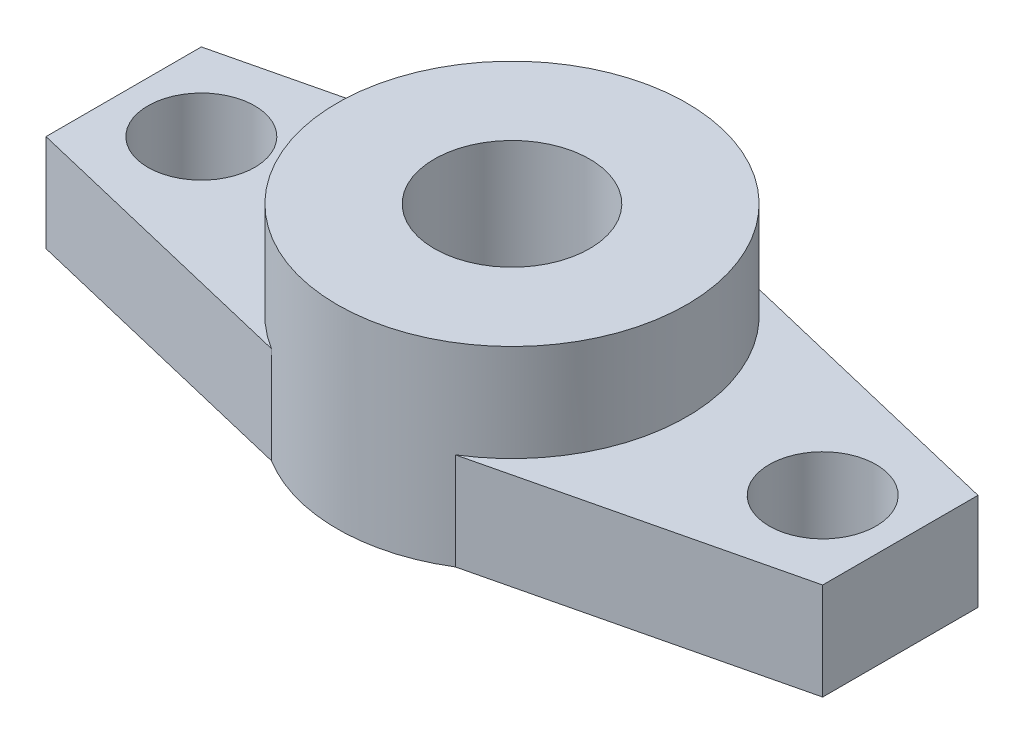
ISO-10303-21;
HEADER;
FILE_DESCRIPTION(('STEP AP214'),'2;1');
FILE_NAME('part.step','',(''),(''),'','','');
FILE_SCHEMA(('AUTOMOTIVE_DESIGN { 1 0 10303 214 1 1 1 1 }'));
ENDSEC;
DATA;
#1=APPLICATION_CONTEXT('core data for automotive mechanical design processes');
#2=APPLICATION_PROTOCOL_DEFINITION('international standard','automotive_design',2000,#1);
#3=PRODUCT_CONTEXT('',#1,'mechanical');
#4=PRODUCT('Part','Part','',(#3));
#5=PRODUCT_RELATED_PRODUCT_CATEGORY('part','',(#4));
#6=PRODUCT_DEFINITION_FORMATION('','',#4);
#7=PRODUCT_DEFINITION_CONTEXT('part definition',#1,'design');
#8=PRODUCT_DEFINITION('design','',#6,#7);
#9=PRODUCT_DEFINITION_SHAPE('','',#8);
#10=(LENGTH_UNIT() NAMED_UNIT(*) SI_UNIT(.MILLI.,.METRE.));
#11=(NAMED_UNIT(*) PLANE_ANGLE_UNIT() SI_UNIT($,.RADIAN.));
#12=(NAMED_UNIT(*) SI_UNIT($,.STERADIAN.) SOLID_ANGLE_UNIT());
#13=UNCERTAINTY_MEASURE_WITH_UNIT(LENGTH_MEASURE(1.E-05),#10,'distance_accuracy_value','');
#14=(GEOMETRIC_REPRESENTATION_CONTEXT(3) GLOBAL_UNCERTAINTY_ASSIGNED_CONTEXT((#13)) GLOBAL_UNIT_ASSIGNED_CONTEXT((#10,
#11,#12)) REPRESENTATION_CONTEXT('',''));
#15=CARTESIAN_POINT('',(0.,0.,0.));
#16=DIRECTION('',(0.,0.,1.));
#17=DIRECTION('',(1.,0.,0.));
#18=AXIS2_PLACEMENT_3D('',#15,#16,#17);
#19=CARTESIAN_POINT('',(0.,5.,0.));
#20=DIRECTION('',(0.,1.,0.));
#21=DIRECTION('',(0.,0.,1.));
#22=AXIS2_PLACEMENT_3D('',#19,#20,#21);
#23=PLANE('',#22);
#24=CARTESIAN_POINT('',(-16.,5.,0.));
#25=DIRECTION('',(0.,1.,0.));
#26=DIRECTION('',(0.,0.,1.));
#27=AXIS2_PLACEMENT_3D('',#24,#25,#26);
#28=CIRCLE('',#27,2.75);
#29=CARTESIAN_POINT('',(-16.,5.,2.75));
#30=VERTEX_POINT('',#29);
#31=EDGE_CURVE('E130',#30,#30,#28,.T.);
#32=ORIENTED_EDGE('',*,*,#31,.F.);
#33=EDGE_LOOP('',(#32));
#34=FACE_BOUND('',#33,.T.);
#35=DIRECTION('',(0.972522655977024,0.,0.232808255032755));
#36=VECTOR('',#35,1.);
#37=CARTESIAN_POINT('',(-1.98963888229925,5.,8.31142731591103));
#38=LINE('',#37,#36);
#39=CARTESIAN_POINT('',(-20.,5.,4.));
#40=VERTEX_POINT('',#39);
#41=CARTESIAN_POINT('',(-4.73372372060233,5.,7.65453197373993));
#42=VERTEX_POINT('',#41);
#43=EDGE_CURVE('E52',#40,#42,#38,.T.);
#44=ORIENTED_EDGE('',*,*,#43,.T.);
#45=CARTESIAN_POINT('',(0.,5.,0.));
#46=DIRECTION('',(0.,1.,0.));
#47=DIRECTION('',(0.,0.,1.));
#48=AXIS2_PLACEMENT_3D('',#45,#46,#47);
#49=CIRCLE('',#48,9.);
#50=CARTESIAN_POINT('',(-4.73372372060233,5.,-7.65453197373993));
#51=VERTEX_POINT('',#50);
#52=EDGE_CURVE('E121',#42,#51,#49,.F.);
#53=ORIENTED_EDGE('',*,*,#52,.T.);
#54=DIRECTION('',(0.972522655977024,0.,-0.232808255032755));
#55=VECTOR('',#54,1.);
#56=CARTESIAN_POINT('',(-1.98963888229925,5.,-8.31142731591103));
#57=LINE('',#56,#55);
#58=CARTESIAN_POINT('',(-20.,5.,-4.));
#59=VERTEX_POINT('',#58);
#60=EDGE_CURVE('E111',#59,#51,#57,.T.);
#61=ORIENTED_EDGE('',*,*,#60,.F.);
#62=DIRECTION('',(0.,0.,1.));
#63=VECTOR('',#62,1.);
#64=CARTESIAN_POINT('',(-20.,5.,0.));
#65=LINE('',#64,#63);
#66=EDGE_CURVE('E117',#59,#40,#65,.T.);
#67=ORIENTED_EDGE('',*,*,#66,.T.);
#68=EDGE_LOOP('',(#44,#53,#61,#67));
#69=FACE_BOUND('',#68,.T.);
#70=ADVANCED_FACE('F35',(#34,#69),#23,.T.);
#71=CARTESIAN_POINT('',(16.,5.,0.));
#72=DIRECTION('',(0.,1.,0.));
#73=DIRECTION('',(0.,0.,1.));
#74=AXIS2_PLACEMENT_3D('',#71,#72,#73);
#75=CIRCLE('',#74,2.75);
#76=CARTESIAN_POINT('',(16.,5.,2.74999999999999));
#77=VERTEX_POINT('',#76);
#78=EDGE_CURVE('E133',#77,#77,#75,.T.);
#79=ORIENTED_EDGE('',*,*,#78,.F.);
#80=EDGE_LOOP('',(#79));
#81=FACE_BOUND('',#80,.T.);
#82=DIRECTION('',(-0.972522655977024,0.,-0.232808255032754));
#83=VECTOR('',#82,1.);
#84=CARTESIAN_POINT('',(1.98963888229924,5.,-8.31142731591103));
#85=LINE('',#84,#83);
#86=CARTESIAN_POINT('',(20.,5.,-4.00000000000001));
#87=VERTEX_POINT('',#86);
#88=CARTESIAN_POINT('',(4.73372372060233,5.,-7.65453197373993));
#89=VERTEX_POINT('',#88);
#90=EDGE_CURVE('E123',#87,#89,#85,.T.);
#91=ORIENTED_EDGE('',*,*,#90,.T.);
#92=CARTESIAN_POINT('',(4.73372372060233,5.,7.65453197373993));
#93=VERTEX_POINT('',#92);
#94=EDGE_CURVE('E192',#89,#93,#49,.F.);
#95=ORIENTED_EDGE('',*,*,#94,.T.);
#96=DIRECTION('',(-0.972522655977024,0.,0.232808255032754));
#97=VECTOR('',#96,1.);
#98=CARTESIAN_POINT('',(1.98963888229924,5.,8.31142731591103));
#99=LINE('',#98,#97);
#100=CARTESIAN_POINT('',(20.,5.,4.00000000000001));
#101=VERTEX_POINT('',#100);
#102=EDGE_CURVE('E161',#101,#93,#99,.T.);
#103=ORIENTED_EDGE('',*,*,#102,.F.);
#104=DIRECTION('',(0.,0.,1.));
#105=VECTOR('',#104,1.);
#106=CARTESIAN_POINT('',(20.,5.,0.));
#107=LINE('',#106,#105);
#108=EDGE_CURVE('E125',#87,#101,#107,.T.);
#109=ORIENTED_EDGE('',*,*,#108,.F.);
#110=EDGE_LOOP('',(#91,#95,#103,#109));
#111=FACE_BOUND('',#110,.T.);
#112=ADVANCED_FACE('F201',(#81,#111),#23,.T.);
#113=CARTESIAN_POINT('',(1.98963888229924,5.,8.31142731591103));
#114=DIRECTION('',(0.232808255032754,0.,0.972522655977024));
#115=DIRECTION('',(0.972522655977024,0.,-0.232808255032754));
#116=AXIS2_PLACEMENT_3D('',#113,#114,#115);
#117=PLANE('',#116);
#118=DIRECTION('',(-0.972522655977024,0.,0.232808255032754));
#119=VECTOR('',#118,1.);
#120=CARTESIAN_POINT('',(1.98963888229924,0.,8.31142731591103));
#121=LINE('',#120,#119);
#122=CARTESIAN_POINT('',(20.,0.,4.00000000000001));
#123=VERTEX_POINT('',#122);
#124=CARTESIAN_POINT('',(4.73372372060233,0.,7.65453197373993));
#125=VERTEX_POINT('',#124);
#126=EDGE_CURVE('E143',#123,#125,#121,.T.);
#127=ORIENTED_EDGE('',*,*,#126,.F.);
#128=DIRECTION('',(0.,-1.,0.));
#129=VECTOR('',#128,1.);
#130=CARTESIAN_POINT('',(20.,5.,4.00000000000001));
#131=LINE('',#130,#129);
#132=EDGE_CURVE('E44',#101,#123,#131,.T.);
#133=ORIENTED_EDGE('',*,*,#132,.F.);
#134=ORIENTED_EDGE('',*,*,#102,.T.);
#135=DIRECTION('',(0.,-1.,0.));
#136=VECTOR('',#135,1.);
#137=CARTESIAN_POINT('',(4.73372372060233,5.,7.65453197373993));
#138=LINE('',#137,#136);
#139=EDGE_CURVE('E11',#93,#125,#138,.T.);
#140=ORIENTED_EDGE('',*,*,#139,.T.);
#141=EDGE_LOOP('',(#127,#133,#134,#140));
#142=FACE_BOUND('',#141,.T.);
#143=ADVANCED_FACE('F174',(#142),#117,.T.);
#144=CARTESIAN_POINT('',(20.,5.,0.));
#145=DIRECTION('',(1.,0.,0.));
#146=DIRECTION('',(0.,0.,-1.));
#147=AXIS2_PLACEMENT_3D('',#144,#145,#146);
#148=PLANE('',#147);
#149=DIRECTION('',(0.,0.,1.));
#150=VECTOR('',#149,1.);
#151=CARTESIAN_POINT('',(20.,0.,0.));
#152=LINE('',#151,#150);
#153=CARTESIAN_POINT('',(20.,0.,-4.00000000000001));
#154=VERTEX_POINT('',#153);
#155=EDGE_CURVE('E147',#154,#123,#152,.T.);
#156=ORIENTED_EDGE('',*,*,#155,.F.);
#157=DIRECTION('',(0.,-1.,0.));
#158=VECTOR('',#157,1.);
#159=CARTESIAN_POINT('',(20.,5.,-4.00000000000001));
#160=LINE('',#159,#158);
#161=EDGE_CURVE('E168',#87,#154,#160,.T.);
#162=ORIENTED_EDGE('',*,*,#161,.F.);
#163=ORIENTED_EDGE('',*,*,#108,.T.);
#164=ORIENTED_EDGE('',*,*,#132,.T.);
#165=EDGE_LOOP('',(#156,#162,#163,#164));
#166=FACE_BOUND('',#165,.T.);
#167=ADVANCED_FACE('F172',(#166),#148,.T.);
#168=CARTESIAN_POINT('',(1.98963888229924,5.,-8.31142731591103));
#169=DIRECTION('',(-0.232808255032754,0.,0.972522655977024));
#170=DIRECTION('',(0.972522655977024,0.,0.232808255032754));
#171=AXIS2_PLACEMENT_3D('',#168,#169,#170);
#172=PLANE('',#171);
#173=DIRECTION('',(-0.972522655977024,0.,-0.232808255032754));
#174=VECTOR('',#173,1.);
#175=CARTESIAN_POINT('',(1.98963888229924,0.,-8.31142731591103));
#176=LINE('',#175,#174);
#177=CARTESIAN_POINT('',(4.73372372060233,0.,-7.65453197373993));
#178=VERTEX_POINT('',#177);
#179=EDGE_CURVE('E150',#154,#178,#176,.T.);
#180=ORIENTED_EDGE('',*,*,#179,.T.);
#181=DIRECTION('',(0.,-1.,0.));
#182=VECTOR('',#181,1.);
#183=CARTESIAN_POINT('',(4.73372372060233,5.,-7.65453197373993));
#184=LINE('',#183,#182);
#185=EDGE_CURVE('E165',#89,#178,#184,.T.);
#186=ORIENTED_EDGE('',*,*,#185,.F.);
#187=ORIENTED_EDGE('',*,*,#90,.F.);
#188=ORIENTED_EDGE('',*,*,#161,.T.);
#189=EDGE_LOOP('',(#180,#186,#187,#188));
#190=FACE_BOUND('',#189,.T.);
#191=ADVANCED_FACE('F185',(#190),#172,.F.);
#192=CARTESIAN_POINT('',(0.,5.,0.));
#193=DIRECTION('',(0.,-1.,0.));
#194=DIRECTION('',(0.,0.,-1.));
#195=AXIS2_PLACEMENT_3D('',#192,#193,#194);
#196=CYLINDRICAL_SURFACE('',#195,9.);
#197=CARTESIAN_POINT('',(0.,0.,0.));
#198=DIRECTION('',(0.,1.,0.));
#199=DIRECTION('',(0.,0.,1.));
#200=AXIS2_PLACEMENT_3D('',#197,#198,#199);
#201=CIRCLE('',#200,9.);
#202=CARTESIAN_POINT('',(-4.73372372060233,0.,-7.65453197373993));
#203=VERTEX_POINT('',#202);
#204=EDGE_CURVE('E144',#178,#203,#201,.T.);
#205=ORIENTED_EDGE('',*,*,#204,.T.);
#206=DIRECTION('',(0.,-1.,0.));
#207=VECTOR('',#206,1.);
#208=CARTESIAN_POINT('',(-4.73372372060233,5.,-7.65453197373993));
#209=LINE('',#208,#207);
#210=EDGE_CURVE('E114',#51,#203,#209,.T.);
#211=ORIENTED_EDGE('',*,*,#210,.F.);
#212=ORIENTED_EDGE('',*,*,#52,.F.);
#213=DIRECTION('',(0.,-1.,0.));
#214=VECTOR('',#213,1.);
#215=CARTESIAN_POINT('',(-4.73372372060233,5.,7.65453197373993));
#216=LINE('',#215,#214);
#217=CARTESIAN_POINT('',(-4.73372372060233,0.,7.65453197373993));
#218=VERTEX_POINT('',#217);
#219=EDGE_CURVE('E136',#42,#218,#216,.T.);
#220=ORIENTED_EDGE('',*,*,#219,.T.);
#221=EDGE_CURVE('E140',#218,#125,#201,.T.);
#222=ORIENTED_EDGE('',*,*,#221,.T.);
#223=ORIENTED_EDGE('',*,*,#139,.F.);
#224=ORIENTED_EDGE('',*,*,#94,.F.);
#225=ORIENTED_EDGE('',*,*,#185,.T.);
#226=EDGE_LOOP('',(#205,#211,#212,#220,#222,#223,#224,#225));
#227=FACE_BOUND('',#226,.T.);
#228=CARTESIAN_POINT('',(0.,10.,0.));
#229=DIRECTION('',(0.,1.,0.));
#230=DIRECTION('',(0.,0.,1.));
#231=AXIS2_PLACEMENT_3D('',#228,#229,#230);
#232=CIRCLE('',#231,9.);
#233=CARTESIAN_POINT('',(0.,10.,9.));
#234=VERTEX_POINT('',#233);
#235=EDGE_CURVE('E194',#234,#234,#232,.T.);
#236=ORIENTED_EDGE('',*,*,#235,.F.);
#237=EDGE_LOOP('',(#236));
#238=FACE_BOUND('',#237,.T.);
#239=ADVANCED_FACE('F189',(#227,#238),#196,.T.);
#240=CARTESIAN_POINT('',(-1.98963888229925,5.,-8.31142731591103));
#241=DIRECTION('',(-0.232808255032755,0.,-0.972522655977024));
#242=DIRECTION('',(-0.972522655977023,0.,0.232808255032755));
#243=AXIS2_PLACEMENT_3D('',#240,#241,#242);
#244=PLANE('',#243);
#245=DIRECTION('',(0.972522655977024,0.,-0.232808255032755));
#246=VECTOR('',#245,1.);
#247=CARTESIAN_POINT('',(-1.98963888229925,0.,-8.31142731591103));
#248=LINE('',#247,#246);
#249=CARTESIAN_POINT('',(-20.,0.,-4.));
#250=VERTEX_POINT('',#249);
#251=EDGE_CURVE('E113',#250,#203,#248,.T.);
#252=ORIENTED_EDGE('',*,*,#251,.F.);
#253=DIRECTION('',(0.,-1.,0.));
#254=VECTOR('',#253,1.);
#255=CARTESIAN_POINT('',(-20.,5.,-4.));
#256=LINE('',#255,#254);
#257=EDGE_CURVE('E107',#59,#250,#256,.T.);
#258=ORIENTED_EDGE('',*,*,#257,.F.);
#259=ORIENTED_EDGE('',*,*,#60,.T.);
#260=ORIENTED_EDGE('',*,*,#210,.T.);
#261=EDGE_LOOP('',(#252,#258,#259,#260));
#262=FACE_BOUND('',#261,.T.);
#263=ADVANCED_FACE('F109',(#262),#244,.T.);
#264=CARTESIAN_POINT('',(-20.,5.,0.));
#265=DIRECTION('',(1.,0.,0.));
#266=DIRECTION('',(0.,0.,-1.));
#267=AXIS2_PLACEMENT_3D('',#264,#265,#266);
#268=PLANE('',#267);
#269=DIRECTION('',(0.,0.,1.));
#270=VECTOR('',#269,1.);
#271=CARTESIAN_POINT('',(-20.,0.,0.));
#272=LINE('',#271,#270);
#273=CARTESIAN_POINT('',(-20.,0.,4.));
#274=VERTEX_POINT('',#273);
#275=EDGE_CURVE('E80',#250,#274,#272,.T.);
#276=ORIENTED_EDGE('',*,*,#275,.T.);
#277=DIRECTION('',(0.,-1.,0.));
#278=VECTOR('',#277,1.);
#279=CARTESIAN_POINT('',(-20.,5.,4.));
#280=LINE('',#279,#278);
#281=EDGE_CURVE('E115',#40,#274,#280,.T.);
#282=ORIENTED_EDGE('',*,*,#281,.F.);
#283=ORIENTED_EDGE('',*,*,#66,.F.);
#284=ORIENTED_EDGE('',*,*,#257,.T.);
#285=EDGE_LOOP('',(#276,#282,#283,#284));
#286=FACE_BOUND('',#285,.T.);
#287=ADVANCED_FACE('F118',(#286),#268,.F.);
#288=CARTESIAN_POINT('',(-16.,5.,0.));
#289=DIRECTION('',(0.,-1.,0.));
#290=DIRECTION('',(0.,0.,-1.));
#291=AXIS2_PLACEMENT_3D('',#288,#289,#290);
#292=CYLINDRICAL_SURFACE('',#291,2.75);
#293=ORIENTED_EDGE('',*,*,#31,.T.);
#294=EDGE_LOOP('',(#293));
#295=FACE_BOUND('',#294,.T.);
#296=CARTESIAN_POINT('',(-16.,0.,0.));
#297=DIRECTION('',(0.,1.,0.));
#298=DIRECTION('',(0.,0.,1.));
#299=AXIS2_PLACEMENT_3D('',#296,#297,#298);
#300=CIRCLE('',#299,2.75);
#301=CARTESIAN_POINT('',(-16.,0.,2.75));
#302=VERTEX_POINT('',#301);
#303=EDGE_CURVE('E155',#302,#302,#300,.T.);
#304=ORIENTED_EDGE('',*,*,#303,.F.);
#305=EDGE_LOOP('',(#304));
#306=FACE_BOUND('',#305,.T.);
#307=ADVANCED_FACE('F221',(#295,#306),#292,.F.);
#308=CARTESIAN_POINT('',(-1.98963888229925,5.,8.31142731591103));
#309=DIRECTION('',(0.232808255032755,0.,-0.972522655977024));
#310=DIRECTION('',(-0.972522655977023,0.,-0.232808255032755));
#311=AXIS2_PLACEMENT_3D('',#308,#309,#310);
#312=PLANE('',#311);
#313=DIRECTION('',(0.972522655977024,0.,0.232808255032755));
#314=VECTOR('',#313,1.);
#315=CARTESIAN_POINT('',(-1.98963888229925,0.,8.31142731591103));
#316=LINE('',#315,#314);
#317=EDGE_CURVE('E86',#274,#218,#316,.T.);
#318=ORIENTED_EDGE('',*,*,#317,.T.);
#319=ORIENTED_EDGE('',*,*,#219,.F.);
#320=ORIENTED_EDGE('',*,*,#43,.F.);
#321=ORIENTED_EDGE('',*,*,#281,.T.);
#322=EDGE_LOOP('',(#318,#319,#320,#321));
#323=FACE_BOUND('',#322,.T.);
#324=ADVANCED_FACE('F224',(#323),#312,.F.);
#325=CARTESIAN_POINT('',(0.,5.,0.));
#326=DIRECTION('',(0.,-1.,0.));
#327=DIRECTION('',(0.,0.,-1.));
#328=AXIS2_PLACEMENT_3D('',#325,#326,#327);
#329=CYLINDRICAL_SURFACE('',#328,4.);
#330=CARTESIAN_POINT('',(0.,0.,0.));
#331=DIRECTION('',(0.,1.,0.));
#332=DIRECTION('',(0.,0.,1.));
#333=AXIS2_PLACEMENT_3D('',#330,#331,#332);
#334=CIRCLE('',#333,4.);
#335=CARTESIAN_POINT('',(0.,0.,4.));
#336=VERTEX_POINT('',#335);
#337=EDGE_CURVE('E137',#336,#336,#334,.T.);
#338=ORIENTED_EDGE('',*,*,#337,.F.);
#339=EDGE_LOOP('',(#338));
#340=FACE_BOUND('',#339,.T.);
#341=CARTESIAN_POINT('',(0.,10.,0.));
#342=DIRECTION('',(0.,1.,0.));
#343=DIRECTION('',(0.,0.,1.));
#344=AXIS2_PLACEMENT_3D('',#341,#342,#343);
#345=CIRCLE('',#344,4.);
#346=CARTESIAN_POINT('',(0.,10.,4.));
#347=VERTEX_POINT('',#346);
#348=EDGE_CURVE('E197',#347,#347,#345,.T.);
#349=ORIENTED_EDGE('',*,*,#348,.T.);
#350=EDGE_LOOP('',(#349));
#351=FACE_BOUND('',#350,.T.);
#352=ADVANCED_FACE('F37',(#340,#351),#329,.F.);
#353=CARTESIAN_POINT('',(16.,5.,0.));
#354=DIRECTION('',(0.,-1.,0.));
#355=DIRECTION('',(0.,0.,-1.));
#356=AXIS2_PLACEMENT_3D('',#353,#354,#355);
#357=CYLINDRICAL_SURFACE('',#356,2.75);
#358=ORIENTED_EDGE('',*,*,#78,.T.);
#359=EDGE_LOOP('',(#358));
#360=FACE_BOUND('',#359,.T.);
#361=CARTESIAN_POINT('',(16.,0.,0.));
#362=DIRECTION('',(0.,1.,0.));
#363=DIRECTION('',(0.,0.,1.));
#364=AXIS2_PLACEMENT_3D('',#361,#362,#363);
#365=CIRCLE('',#364,2.75);
#366=CARTESIAN_POINT('',(16.,0.,2.74999999999999));
#367=VERTEX_POINT('',#366);
#368=EDGE_CURVE('E158',#367,#367,#365,.T.);
#369=ORIENTED_EDGE('',*,*,#368,.F.);
#370=EDGE_LOOP('',(#369));
#371=FACE_BOUND('',#370,.T.);
#372=ADVANCED_FACE('F216',(#360,#371),#357,.F.);
#373=CARTESIAN_POINT('',(0.,0.,0.));
#374=DIRECTION('',(0.,1.,0.));
#375=DIRECTION('',(0.,0.,1.));
#376=AXIS2_PLACEMENT_3D('',#373,#374,#375);
#377=PLANE('',#376);
#378=ORIENTED_EDGE('',*,*,#337,.T.);
#379=EDGE_LOOP('',(#378));
#380=FACE_BOUND('',#379,.T.);
#381=ORIENTED_EDGE('',*,*,#221,.F.);
#382=ORIENTED_EDGE('',*,*,#317,.F.);
#383=ORIENTED_EDGE('',*,*,#275,.F.);
#384=ORIENTED_EDGE('',*,*,#251,.T.);
#385=ORIENTED_EDGE('',*,*,#204,.F.);
#386=ORIENTED_EDGE('',*,*,#179,.F.);
#387=ORIENTED_EDGE('',*,*,#155,.T.);
#388=ORIENTED_EDGE('',*,*,#126,.T.);
#389=EDGE_LOOP('',(#381,#382,#383,#384,#385,#386,#387,#388));
#390=FACE_BOUND('',#389,.T.);
#391=ORIENTED_EDGE('',*,*,#368,.T.);
#392=EDGE_LOOP('',(#391));
#393=FACE_BOUND('',#392,.T.);
#394=ORIENTED_EDGE('',*,*,#303,.T.);
#395=EDGE_LOOP('',(#394));
#396=FACE_BOUND('',#395,.T.);
#397=ADVANCED_FACE('F179',(#380,#390,#393,#396),#377,.F.);
#398=CARTESIAN_POINT('',(0.,10.,0.));
#399=DIRECTION('',(0.,1.,0.));
#400=DIRECTION('',(0.,0.,1.));
#401=AXIS2_PLACEMENT_3D('',#398,#399,#400);
#402=PLANE('',#401);
#403=ORIENTED_EDGE('',*,*,#348,.F.);
#404=EDGE_LOOP('',(#403));
#405=FACE_BOUND('',#404,.T.);
#406=ORIENTED_EDGE('',*,*,#235,.T.);
#407=EDGE_LOOP('',(#406));
#408=FACE_BOUND('',#407,.T.);
#409=ADVANCED_FACE('F213',(#405,#408),#402,.T.);
#410=CLOSED_SHELL('',(#70,#112,#143,#167,#191,#239,#263,#287,#307,#324,#352,#372,#397,#409));
#411=MANIFOLD_SOLID_BREP('B2',#410);
#412=ADVANCED_BREP_SHAPE_REPRESENTATION('',(#18,#411),#14);
#413=SHAPE_DEFINITION_REPRESENTATION(#9,#412);
ENDSEC;
END-ISO-10303-21;
